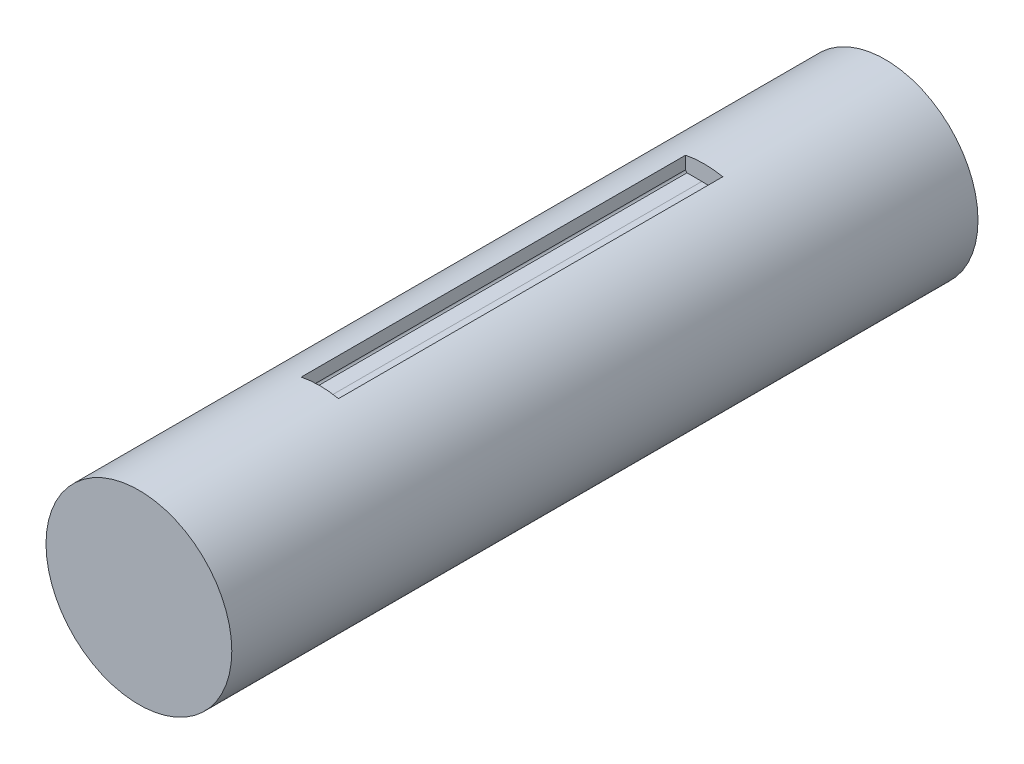
ISO-10303-21;
HEADER;
FILE_DESCRIPTION(('STEP AP214'),'2;1');
FILE_NAME('part.step','',(''),(''),'','','');
FILE_SCHEMA(('AUTOMOTIVE_DESIGN { 1 0 10303 214 1 1 1 1 }'));
ENDSEC;
DATA;
#1=APPLICATION_CONTEXT('core data for automotive mechanical design processes');
#2=APPLICATION_PROTOCOL_DEFINITION('international standard','automotive_design',2000,#1);
#3=PRODUCT_CONTEXT('',#1,'mechanical');
#4=PRODUCT('Part','Part','',(#3));
#5=PRODUCT_RELATED_PRODUCT_CATEGORY('part','',(#4));
#6=PRODUCT_DEFINITION_FORMATION('','',#4);
#7=PRODUCT_DEFINITION_CONTEXT('part definition',#1,'design');
#8=PRODUCT_DEFINITION('design','',#6,#7);
#9=PRODUCT_DEFINITION_SHAPE('','',#8);
#10=(LENGTH_UNIT() NAMED_UNIT(*) SI_UNIT(.MILLI.,.METRE.));
#11=(NAMED_UNIT(*) PLANE_ANGLE_UNIT() SI_UNIT($,.RADIAN.));
#12=(NAMED_UNIT(*) SI_UNIT($,.STERADIAN.) SOLID_ANGLE_UNIT());
#13=UNCERTAINTY_MEASURE_WITH_UNIT(LENGTH_MEASURE(1.E-05),#10,'distance_accuracy_value','');
#14=(GEOMETRIC_REPRESENTATION_CONTEXT(3) GLOBAL_UNCERTAINTY_ASSIGNED_CONTEXT((#13)) GLOBAL_UNIT_ASSIGNED_CONTEXT((#10,
#11,#12)) REPRESENTATION_CONTEXT('',''));
#15=CARTESIAN_POINT('',(0.,0.,0.));
#16=DIRECTION('',(0.,0.,1.));
#17=DIRECTION('',(1.,0.,0.));
#18=AXIS2_PLACEMENT_3D('',#15,#16,#17);
#19=CARTESIAN_POINT('',(0.,0.,100.));
#20=DIRECTION('',(0.,0.,-1.));
#21=DIRECTION('',(-1.,0.,0.));
#22=AXIS2_PLACEMENT_3D('',#19,#20,#21);
#23=CYLINDRICAL_SURFACE('',#22,24.9);
#24=CARTESIAN_POINT('',(0.,0.,-51.5));
#25=DIRECTION('',(0.,0.,1.));
#26=DIRECTION('',(1.,0.,0.));
#27=AXIS2_PLACEMENT_3D('',#24,#25,#26);
#28=CIRCLE('',#27,24.9);
#29=CARTESIAN_POINT('',(4.99999999999997,24.3928268144551,-51.5));
#30=VERTEX_POINT('',#29);
#31=CARTESIAN_POINT('',(-4.99999999999997,24.3928268144551,-51.5));
#32=VERTEX_POINT('',#31);
#33=EDGE_CURVE('E203',#30,#32,#28,.T.);
#34=ORIENTED_EDGE('',*,*,#33,.F.);
#35=DIRECTION('',(0.,0.,1.));
#36=VECTOR('',#35,1.);
#37=CARTESIAN_POINT('',(4.99999999999997,24.3928268144551,-51.5));
#38=LINE('',#37,#36);
#39=CARTESIAN_POINT('',(4.99999999999997,24.3928268144551,51.5));
#40=VERTEX_POINT('',#39);
#41=EDGE_CURVE('E220',#30,#40,#38,.T.);
#42=ORIENTED_EDGE('',*,*,#41,.T.);
#43=CARTESIAN_POINT('',(0.,0.,51.5));
#44=DIRECTION('',(0.,0.,1.));
#45=DIRECTION('',(1.,0.,0.));
#46=AXIS2_PLACEMENT_3D('',#43,#44,#45);
#47=CIRCLE('',#46,24.9);
#48=CARTESIAN_POINT('',(-4.99999999999997,24.3928268144551,51.5));
#49=VERTEX_POINT('',#48);
#50=EDGE_CURVE('E223',#40,#49,#47,.T.);
#51=ORIENTED_EDGE('',*,*,#50,.T.);
#52=DIRECTION('',(0.,0.,1.));
#53=VECTOR('',#52,1.);
#54=CARTESIAN_POINT('',(-4.99999999999997,24.3928268144551,-51.5));
#55=LINE('',#54,#53);
#56=EDGE_CURVE('E248',#32,#49,#55,.T.);
#57=ORIENTED_EDGE('',*,*,#56,.F.);
#58=EDGE_LOOP('',(#34,#42,#51,#57));
#59=FACE_BOUND('',#58,.T.);
#60=CARTESIAN_POINT('',(0.,0.,100.));
#61=DIRECTION('',(0.,0.,1.));
#62=DIRECTION('',(1.,0.,0.));
#63=AXIS2_PLACEMENT_3D('',#60,#61,#62);
#64=CIRCLE('',#63,24.9);
#65=CARTESIAN_POINT('',(24.9,0.,100.));
#66=VERTEX_POINT('',#65);
#67=EDGE_CURVE('E11',#66,#66,#64,.T.);
#68=ORIENTED_EDGE('',*,*,#67,.F.);
#69=EDGE_LOOP('',(#68));
#70=FACE_BOUND('',#69,.T.);
#71=CARTESIAN_POINT('',(0.,0.,-100.));
#72=DIRECTION('',(0.,0.,1.));
#73=DIRECTION('',(1.,0.,0.));
#74=AXIS2_PLACEMENT_3D('',#71,#72,#73);
#75=CIRCLE('',#74,24.9);
#76=CARTESIAN_POINT('',(24.9,0.,-100.));
#77=VERTEX_POINT('',#76);
#78=EDGE_CURVE('E38',#77,#77,#75,.T.);
#79=ORIENTED_EDGE('',*,*,#78,.T.);
#80=EDGE_LOOP('',(#79));
#81=FACE_BOUND('',#80,.T.);
#82=CARTESIAN_POINT('',(0.,0.,-51.5));
#83=DIRECTION('',(0.,0.,1.));
#84=DIRECTION('',(1.,0.,0.));
#85=AXIS2_PLACEMENT_3D('',#82,#83,#84);
#86=CIRCLE('',#85,24.9);
#87=CARTESIAN_POINT('',(-5.00000000000014,-24.392826814455,-51.5));
#88=VERTEX_POINT('',#87);
#89=CARTESIAN_POINT('',(4.9999999999998,-24.3928268144551,-51.5));
#90=VERTEX_POINT('',#89);
#91=EDGE_CURVE('E155',#88,#90,#86,.T.);
#92=ORIENTED_EDGE('',*,*,#91,.F.);
#93=DIRECTION('',(0.,0.,1.));
#94=VECTOR('',#93,1.);
#95=CARTESIAN_POINT('',(-5.00000000000014,-24.392826814455,-51.5));
#96=LINE('',#95,#94);
#97=CARTESIAN_POINT('',(-5.00000000000014,-24.392826814455,51.5));
#98=VERTEX_POINT('',#97);
#99=EDGE_CURVE('E138',#88,#98,#96,.T.);
#100=ORIENTED_EDGE('',*,*,#99,.T.);
#101=CARTESIAN_POINT('',(0.,0.,51.5));
#102=DIRECTION('',(0.,0.,1.));
#103=DIRECTION('',(1.,0.,0.));
#104=AXIS2_PLACEMENT_3D('',#101,#102,#103);
#105=CIRCLE('',#104,24.9);
#106=CARTESIAN_POINT('',(4.9999999999998,-24.3928268144551,51.5));
#107=VERTEX_POINT('',#106);
#108=EDGE_CURVE('E174',#98,#107,#105,.T.);
#109=ORIENTED_EDGE('',*,*,#108,.T.);
#110=DIRECTION('',(0.,0.,1.));
#111=VECTOR('',#110,1.);
#112=CARTESIAN_POINT('',(4.9999999999998,-24.3928268144551,-51.5));
#113=LINE('',#112,#111);
#114=EDGE_CURVE('E148',#90,#107,#113,.T.);
#115=ORIENTED_EDGE('',*,*,#114,.F.);
#116=EDGE_LOOP('',(#92,#100,#109,#115));
#117=FACE_BOUND('',#116,.T.);
#118=ADVANCED_FACE('F35',(#59,#70,#81,#117),#23,.T.);
#119=CARTESIAN_POINT('',(0.,0.,100.));
#120=DIRECTION('',(0.,0.,1.));
#121=DIRECTION('',(1.,0.,0.));
#122=AXIS2_PLACEMENT_3D('',#119,#120,#121);
#123=PLANE('',#122);
#124=ORIENTED_EDGE('',*,*,#67,.T.);
#125=EDGE_LOOP('',(#124));
#126=FACE_BOUND('',#125,.T.);
#127=ADVANCED_FACE('F291',(#126),#123,.T.);
#128=CARTESIAN_POINT('',(0.,0.,-100.));
#129=DIRECTION('',(0.,0.,1.));
#130=DIRECTION('',(1.,0.,0.));
#131=AXIS2_PLACEMENT_3D('',#128,#129,#130);
#132=PLANE('',#131);
#133=ORIENTED_EDGE('',*,*,#78,.F.);
#134=EDGE_LOOP('',(#133));
#135=FACE_BOUND('',#134,.T.);
#136=ADVANCED_FACE('F295',(#135),#132,.F.);
#137=CARTESIAN_POINT('',(4.99999999999997,0.,-51.5));
#138=DIRECTION('',(1.,0.,0.));
#139=DIRECTION('',(0.,0.,-1.));
#140=AXIS2_PLACEMENT_3D('',#137,#138,#139);
#141=PLANE('',#140);
#142=DIRECTION('',(0.,1.,0.));
#143=VECTOR('',#142,1.);
#144=CARTESIAN_POINT('',(4.99999999999997,0.,51.5));
#145=LINE('',#144,#143);
#146=CARTESIAN_POINT('',(4.99999999999997,21.3211721591414,51.5));
#147=VERTEX_POINT('',#146);
#148=EDGE_CURVE('E190',#147,#40,#145,.T.);
#149=ORIENTED_EDGE('',*,*,#148,.T.);
#150=ORIENTED_EDGE('',*,*,#41,.F.);
#151=DIRECTION('',(0.,1.,0.));
#152=VECTOR('',#151,1.);
#153=CARTESIAN_POINT('',(4.99999999999997,0.,-51.5));
#154=LINE('',#153,#152);
#155=CARTESIAN_POINT('',(4.99999999999997,21.3211721591414,-51.5));
#156=VERTEX_POINT('',#155);
#157=EDGE_CURVE('E200',#156,#30,#154,.T.);
#158=ORIENTED_EDGE('',*,*,#157,.F.);
#159=DIRECTION('',(0.,0.,1.));
#160=VECTOR('',#159,1.);
#161=CARTESIAN_POINT('',(4.99999999999997,21.3211721591414,-51.5));
#162=LINE('',#161,#160);
#163=EDGE_CURVE('E238',#156,#147,#162,.T.);
#164=ORIENTED_EDGE('',*,*,#163,.T.);
#165=EDGE_LOOP('',(#149,#150,#158,#164));
#166=FACE_BOUND('',#165,.T.);
#167=ADVANCED_FACE('F257',(#166),#141,.F.);
#168=CARTESIAN_POINT('',(4.00051874332747,21.3533780213462,-51.5));
#169=DIRECTION('',(0.,0.,1.));
#170=DIRECTION('',(1.,0.,0.));
#171=AXIS2_PLACEMENT_3D('',#168,#169,#170);
#172=CYLINDRICAL_SURFACE('',#171,1.);
#173=CARTESIAN_POINT('',(4.00051874332747,21.3533780213462,51.5));
#174=DIRECTION('',(0.,0.,1.));
#175=DIRECTION('',(1.,0.,0.));
#176=AXIS2_PLACEMENT_3D('',#173,#174,#175);
#177=CIRCLE('',#176,1.);
#178=CARTESIAN_POINT('',(3.96831288112261,20.3538967646737,51.5));
#179=VERTEX_POINT('',#178);
#180=EDGE_CURVE('E204',#179,#147,#177,.T.);
#181=ORIENTED_EDGE('',*,*,#180,.T.);
#182=ORIENTED_EDGE('',*,*,#163,.F.);
#183=CARTESIAN_POINT('',(4.00051874332747,21.3533780213462,-51.5));
#184=DIRECTION('',(0.,0.,1.));
#185=DIRECTION('',(1.,0.,0.));
#186=AXIS2_PLACEMENT_3D('',#183,#184,#185);
#187=CIRCLE('',#186,1.);
#188=CARTESIAN_POINT('',(3.96831288112261,20.3538967646737,-51.5));
#189=VERTEX_POINT('',#188);
#190=EDGE_CURVE('E217',#189,#156,#187,.T.);
#191=ORIENTED_EDGE('',*,*,#190,.F.);
#192=DIRECTION('',(0.,0.,1.));
#193=VECTOR('',#192,1.);
#194=CARTESIAN_POINT('',(3.96831288112261,20.3538967646737,-51.5));
#195=LINE('',#194,#193);
#196=EDGE_CURVE('E240',#189,#179,#195,.T.);
#197=ORIENTED_EDGE('',*,*,#196,.T.);
#198=EDGE_LOOP('',(#181,#182,#191,#197));
#199=FACE_BOUND('',#198,.T.);
#200=ADVANCED_FACE('F266',(#199),#172,.F.);
#201=CARTESIAN_POINT('',(0.659290754414498,20.4605219864416,-51.5));
#202=DIRECTION('',(-0.0322058622048559,-0.999481256672501,0.));
#203=DIRECTION('',(0.999481256672501,-0.0322058622048559,0.));
#204=AXIS2_PLACEMENT_3D('',#201,#202,#203);
#205=PLANE('',#204);
#206=DIRECTION('',(0.999481256672501,-0.0322058622048559,0.));
#207=VECTOR('',#206,1.);
#208=CARTESIAN_POINT('',(0.659290754414498,20.4605219864416,51.5));
#209=LINE('',#208,#207);
#210=CARTESIAN_POINT('',(-0.605290303798041,20.5012700475341,51.5));
#211=VERTEX_POINT('',#210);
#212=EDGE_CURVE('E233',#211,#179,#209,.T.);
#213=ORIENTED_EDGE('',*,*,#212,.T.);
#214=ORIENTED_EDGE('',*,*,#196,.F.);
#215=DIRECTION('',(0.999481256672501,-0.0322058622048559,0.));
#216=VECTOR('',#215,1.);
#217=CARTESIAN_POINT('',(0.659290754414498,20.4605219864416,-51.5));
#218=LINE('',#217,#216);
#219=CARTESIAN_POINT('',(-0.605290303798041,20.5012700475341,-51.5));
#220=VERTEX_POINT('',#219);
#221=EDGE_CURVE('E214',#220,#189,#218,.T.);
#222=ORIENTED_EDGE('',*,*,#221,.F.);
#223=DIRECTION('',(0.,0.,1.));
#224=VECTOR('',#223,1.);
#225=CARTESIAN_POINT('',(-0.605290303798041,20.5012700475341,-51.5));
#226=LINE('',#225,#224);
#227=EDGE_CURVE('E242',#220,#211,#226,.T.);
#228=ORIENTED_EDGE('',*,*,#227,.T.);
#229=EDGE_LOOP('',(#213,#214,#222,#228));
#230=FACE_BOUND('',#229,.T.);
#231=ADVANCED_FACE('F272',(#230),#205,.F.);
#232=CARTESIAN_POINT('',(0.,20.5012700475341,-51.5));
#233=DIRECTION('',(0.,1.,0.));
#234=DIRECTION('',(0.,0.,1.));
#235=AXIS2_PLACEMENT_3D('',#232,#233,#234);
#236=PLANE('',#235);
#237=DIRECTION('',(-1.,0.,0.));
#238=VECTOR('',#237,1.);
#239=CARTESIAN_POINT('',(0.,20.5012700475341,51.5));
#240=LINE('',#239,#238);
#241=CARTESIAN_POINT('',(-4.60529030380203,20.5012700475341,51.5));
#242=VERTEX_POINT('',#241);
#243=EDGE_CURVE('E230',#211,#242,#240,.T.);
#244=ORIENTED_EDGE('',*,*,#243,.F.);
#245=ORIENTED_EDGE('',*,*,#227,.F.);
#246=DIRECTION('',(-1.,0.,0.));
#247=VECTOR('',#246,1.);
#248=CARTESIAN_POINT('',(0.,20.5012700475341,-51.5));
#249=LINE('',#248,#247);
#250=CARTESIAN_POINT('',(-4.60529030380203,20.5012700475341,-51.5));
#251=VERTEX_POINT('',#250);
#252=EDGE_CURVE('E212',#220,#251,#249,.T.);
#253=ORIENTED_EDGE('',*,*,#252,.T.);
#254=DIRECTION('',(0.,0.,1.));
#255=VECTOR('',#254,1.);
#256=CARTESIAN_POINT('',(-4.60529030380203,20.5012700475341,-51.5));
#257=LINE('',#256,#255);
#258=EDGE_CURVE('E244',#251,#242,#257,.T.);
#259=ORIENTED_EDGE('',*,*,#258,.T.);
#260=EDGE_LOOP('',(#244,#245,#253,#259));
#261=FACE_BOUND('',#260,.T.);
#262=ADVANCED_FACE('F274',(#261),#236,.T.);
#263=CARTESIAN_POINT('',(-4.05921609750254,21.3390068565704,-51.5));
#264=DIRECTION('',(0.,0.,1.));
#265=DIRECTION('',(1.,0.,0.));
#266=AXIS2_PLACEMENT_3D('',#263,#264,#265);
#267=CYLINDRICAL_SURFACE('',#266,1.00000000000001);
#268=CARTESIAN_POINT('',(-4.05921609750254,21.3390068565704,51.5));
#269=DIRECTION('',(0.,0.,1.));
#270=DIRECTION('',(1.,0.,0.));
#271=AXIS2_PLACEMENT_3D('',#268,#269,#270);
#272=CIRCLE('',#271,1.00000000000001);
#273=CARTESIAN_POINT('',(-4.99999999999997,21.,51.5));
#274=VERTEX_POINT('',#273);
#275=EDGE_CURVE('E227',#274,#242,#272,.T.);
#276=ORIENTED_EDGE('',*,*,#275,.T.);
#277=ORIENTED_EDGE('',*,*,#258,.F.);
#278=CARTESIAN_POINT('',(-4.05921609750254,21.3390068565704,-51.5));
#279=DIRECTION('',(0.,0.,1.));
#280=DIRECTION('',(1.,0.,0.));
#281=AXIS2_PLACEMENT_3D('',#278,#279,#280);
#282=CIRCLE('',#281,1.00000000000001);
#283=CARTESIAN_POINT('',(-4.99999999999997,21.,-51.5));
#284=VERTEX_POINT('',#283);
#285=EDGE_CURVE('E209',#284,#251,#282,.T.);
#286=ORIENTED_EDGE('',*,*,#285,.F.);
#287=DIRECTION('',(0.,0.,1.));
#288=VECTOR('',#287,1.);
#289=CARTESIAN_POINT('',(-4.99999999999997,21.,-51.5));
#290=LINE('',#289,#288);
#291=EDGE_CURVE('E246',#284,#274,#290,.T.);
#292=ORIENTED_EDGE('',*,*,#291,.T.);
#293=EDGE_LOOP('',(#276,#277,#286,#292));
#294=FACE_BOUND('',#293,.T.);
#295=ADVANCED_FACE('F278',(#294),#267,.F.);
#296=CARTESIAN_POINT('',(-4.99999999999997,0.,-51.5));
#297=DIRECTION('',(1.,0.,0.));
#298=DIRECTION('',(0.,0.,-1.));
#299=AXIS2_PLACEMENT_3D('',#296,#297,#298);
#300=PLANE('',#299);
#301=DIRECTION('',(0.,1.,0.));
#302=VECTOR('',#301,1.);
#303=CARTESIAN_POINT('',(-4.99999999999997,0.,51.5));
#304=LINE('',#303,#302);
#305=EDGE_CURVE('E57',#274,#49,#304,.T.);
#306=ORIENTED_EDGE('',*,*,#305,.F.);
#307=ORIENTED_EDGE('',*,*,#291,.F.);
#308=DIRECTION('',(0.,1.,0.));
#309=VECTOR('',#308,1.);
#310=CARTESIAN_POINT('',(-4.99999999999997,0.,-51.5));
#311=LINE('',#310,#309);
#312=EDGE_CURVE('E207',#284,#32,#311,.T.);
#313=ORIENTED_EDGE('',*,*,#312,.T.);
#314=ORIENTED_EDGE('',*,*,#56,.T.);
#315=EDGE_LOOP('',(#306,#307,#313,#314));
#316=FACE_BOUND('',#315,.T.);
#317=ADVANCED_FACE('F280',(#316),#300,.T.);
#318=CARTESIAN_POINT('',(0.,0.,-51.5));
#319=DIRECTION('',(0.,0.,1.));
#320=DIRECTION('',(1.,0.,0.));
#321=AXIS2_PLACEMENT_3D('',#318,#319,#320);
#322=PLANE('',#321);
#323=ORIENTED_EDGE('',*,*,#157,.T.);
#324=ORIENTED_EDGE('',*,*,#33,.T.);
#325=ORIENTED_EDGE('',*,*,#312,.F.);
#326=ORIENTED_EDGE('',*,*,#285,.T.);
#327=ORIENTED_EDGE('',*,*,#252,.F.);
#328=ORIENTED_EDGE('',*,*,#221,.T.);
#329=ORIENTED_EDGE('',*,*,#190,.T.);
#330=EDGE_LOOP('',(#323,#324,#325,#326,#327,#328,#329));
#331=FACE_BOUND('',#330,.T.);
#332=ADVANCED_FACE('F260',(#331),#322,.T.);
#333=CARTESIAN_POINT('',(0.,0.,51.5));
#334=DIRECTION('',(0.,0.,1.));
#335=DIRECTION('',(1.,0.,0.));
#336=AXIS2_PLACEMENT_3D('',#333,#334,#335);
#337=PLANE('',#336);
#338=ORIENTED_EDGE('',*,*,#148,.F.);
#339=ORIENTED_EDGE('',*,*,#180,.F.);
#340=ORIENTED_EDGE('',*,*,#212,.F.);
#341=ORIENTED_EDGE('',*,*,#243,.T.);
#342=ORIENTED_EDGE('',*,*,#275,.F.);
#343=ORIENTED_EDGE('',*,*,#305,.T.);
#344=ORIENTED_EDGE('',*,*,#50,.F.);
#345=EDGE_LOOP('',(#338,#339,#340,#341,#342,#343,#344));
#346=FACE_BOUND('',#345,.T.);
#347=ADVANCED_FACE('F268',(#346),#337,.F.);
#348=CARTESIAN_POINT('',(-4.99999999999997,0.,-51.5));
#349=DIRECTION('',(-1.,0.,0.));
#350=DIRECTION('',(0.,-1.,0.));
#351=AXIS2_PLACEMENT_3D('',#348,#349,#350);
#352=PLANE('',#351);
#353=DIRECTION('',(0.,-1.,0.));
#354=VECTOR('',#353,1.);
#355=CARTESIAN_POINT('',(-4.99999999999997,0.,51.5));
#356=LINE('',#355,#354);
#357=CARTESIAN_POINT('',(-5.00000000000012,-21.3211721591413,51.5));
#358=VERTEX_POINT('',#357);
#359=EDGE_CURVE('E144',#358,#98,#356,.T.);
#360=ORIENTED_EDGE('',*,*,#359,.T.);
#361=ORIENTED_EDGE('',*,*,#99,.F.);
#362=DIRECTION('',(0.,-1.,0.));
#363=VECTOR('',#362,1.);
#364=CARTESIAN_POINT('',(-4.99999999999997,0.,-51.5));
#365=LINE('',#364,#363);
#366=CARTESIAN_POINT('',(-5.00000000000012,-21.3211721591413,-51.5));
#367=VERTEX_POINT('',#366);
#368=EDGE_CURVE('E141',#367,#88,#365,.T.);
#369=ORIENTED_EDGE('',*,*,#368,.F.);
#370=DIRECTION('',(0.,0.,1.));
#371=VECTOR('',#370,1.);
#372=CARTESIAN_POINT('',(-5.00000000000012,-21.3211721591413,-51.5));
#373=LINE('',#372,#371);
#374=EDGE_CURVE('E188',#367,#358,#373,.T.);
#375=ORIENTED_EDGE('',*,*,#374,.T.);
#376=EDGE_LOOP('',(#360,#361,#369,#375));
#377=FACE_BOUND('',#376,.T.);
#378=ADVANCED_FACE('F140',(#377),#352,.F.);
#379=CARTESIAN_POINT('',(-4.00051874332762,-21.3533780213462,-51.5));
#380=DIRECTION('',(0.,0.,1.));
#381=DIRECTION('',(1.,0.,0.));
#382=AXIS2_PLACEMENT_3D('',#379,#380,#381);
#383=CYLINDRICAL_SURFACE('',#382,1.);
#384=CARTESIAN_POINT('',(-4.00051874332762,-21.3533780213462,51.5));
#385=DIRECTION('',(0.,0.,1.));
#386=DIRECTION('',(1.,0.,0.));
#387=AXIS2_PLACEMENT_3D('',#384,#385,#386);
#388=CIRCLE('',#387,1.);
#389=CARTESIAN_POINT('',(-3.96831288112275,-20.3538967646737,51.5));
#390=VERTEX_POINT('',#389);
#391=EDGE_CURVE('E159',#390,#358,#388,.T.);
#392=ORIENTED_EDGE('',*,*,#391,.T.);
#393=ORIENTED_EDGE('',*,*,#374,.F.);
#394=CARTESIAN_POINT('',(-4.00051874332762,-21.3533780213462,-51.5));
#395=DIRECTION('',(0.,0.,1.));
#396=DIRECTION('',(1.,0.,0.));
#397=AXIS2_PLACEMENT_3D('',#394,#395,#396);
#398=CIRCLE('',#397,1.);
#399=CARTESIAN_POINT('',(-3.96831288112275,-20.3538967646737,-51.5));
#400=VERTEX_POINT('',#399);
#401=EDGE_CURVE('E149',#400,#367,#398,.T.);
#402=ORIENTED_EDGE('',*,*,#401,.F.);
#403=DIRECTION('',(0.,0.,1.));
#404=VECTOR('',#403,1.);
#405=CARTESIAN_POINT('',(-3.96831288112275,-20.3538967646737,-51.5));
#406=LINE('',#405,#404);
#407=EDGE_CURVE('E191',#400,#390,#406,.T.);
#408=ORIENTED_EDGE('',*,*,#407,.T.);
#409=EDGE_LOOP('',(#392,#393,#402,#408));
#410=FACE_BOUND('',#409,.T.);
#411=ADVANCED_FACE('F348',(#410),#383,.F.);
#412=CARTESIAN_POINT('',(-0.659290754414638,-20.4605219864416,-51.5));
#413=DIRECTION('',(0.0322058622048628,0.999481256672501,0.));
#414=DIRECTION('',(-0.999481256672501,0.0322058622048628,0.));
#415=AXIS2_PLACEMENT_3D('',#412,#413,#414);
#416=PLANE('',#415);
#417=DIRECTION('',(-0.999481256672501,0.0322058622048628,0.));
#418=VECTOR('',#417,1.);
#419=CARTESIAN_POINT('',(-0.659290754414638,-20.4605219864416,51.5));
#420=LINE('',#419,#418);
#421=CARTESIAN_POINT('',(0.605290303797898,-20.5012700475341,51.5));
#422=VERTEX_POINT('',#421);
#423=EDGE_CURVE('E183',#422,#390,#420,.T.);
#424=ORIENTED_EDGE('',*,*,#423,.T.);
#425=ORIENTED_EDGE('',*,*,#407,.F.);
#426=DIRECTION('',(-0.999481256672501,0.0322058622048628,0.));
#427=VECTOR('',#426,1.);
#428=CARTESIAN_POINT('',(-0.659290754414638,-20.4605219864416,-51.5));
#429=LINE('',#428,#427);
#430=CARTESIAN_POINT('',(0.605290303797898,-20.5012700475341,-51.5));
#431=VERTEX_POINT('',#430);
#432=EDGE_CURVE('E170',#431,#400,#429,.T.);
#433=ORIENTED_EDGE('',*,*,#432,.F.);
#434=DIRECTION('',(0.,0.,1.));
#435=VECTOR('',#434,1.);
#436=CARTESIAN_POINT('',(0.605290303797898,-20.5012700475341,-51.5));
#437=LINE('',#436,#435);
#438=EDGE_CURVE('E193',#431,#422,#437,.T.);
#439=ORIENTED_EDGE('',*,*,#438,.T.);
#440=EDGE_LOOP('',(#424,#425,#433,#439));
#441=FACE_BOUND('',#440,.T.);
#442=ADVANCED_FACE('F357',(#441),#416,.F.);
#443=CARTESIAN_POINT('',(-1.42256137755048E-13,-20.5012700475341,-51.5));
#444=DIRECTION('',(0.,-1.,0.));
#445=DIRECTION('',(1.,0.,0.));
#446=AXIS2_PLACEMENT_3D('',#443,#444,#445);
#447=PLANE('',#446);
#448=DIRECTION('',(1.,0.,0.));
#449=VECTOR('',#448,1.);
#450=CARTESIAN_POINT('',(-1.42256137755048E-13,-20.5012700475341,51.5));
#451=LINE('',#450,#449);
#452=CARTESIAN_POINT('',(4.60529030380189,-20.5012700475341,51.5));
#453=VERTEX_POINT('',#452);
#454=EDGE_CURVE('E180',#422,#453,#451,.T.);
#455=ORIENTED_EDGE('',*,*,#454,.F.);
#456=ORIENTED_EDGE('',*,*,#438,.F.);
#457=DIRECTION('',(1.,0.,0.));
#458=VECTOR('',#457,1.);
#459=CARTESIAN_POINT('',(-1.42256137755048E-13,-20.5012700475341,-51.5));
#460=LINE('',#459,#458);
#461=CARTESIAN_POINT('',(4.60529030380189,-20.5012700475341,-51.5));
#462=VERTEX_POINT('',#461);
#463=EDGE_CURVE('E168',#431,#462,#460,.T.);
#464=ORIENTED_EDGE('',*,*,#463,.T.);
#465=DIRECTION('',(0.,0.,1.));
#466=VECTOR('',#465,1.);
#467=CARTESIAN_POINT('',(4.60529030380189,-20.5012700475341,-51.5));
#468=LINE('',#467,#466);
#469=EDGE_CURVE('E195',#462,#453,#468,.T.);
#470=ORIENTED_EDGE('',*,*,#469,.T.);
#471=EDGE_LOOP('',(#455,#456,#464,#470));
#472=FACE_BOUND('',#471,.T.);
#473=ADVANCED_FACE('F367',(#472),#447,.T.);
#474=CARTESIAN_POINT('',(4.05921609750239,-21.3390068565705,-51.5));
#475=DIRECTION('',(0.,0.,1.));
#476=DIRECTION('',(1.,0.,0.));
#477=AXIS2_PLACEMENT_3D('',#474,#475,#476);
#478=CYLINDRICAL_SURFACE('',#477,1.00000000000001);
#479=CARTESIAN_POINT('',(4.05921609750239,-21.3390068565705,51.5));
#480=DIRECTION('',(0.,0.,1.));
#481=DIRECTION('',(1.,0.,0.));
#482=AXIS2_PLACEMENT_3D('',#479,#480,#481);
#483=CIRCLE('',#482,1.00000000000001);
#484=CARTESIAN_POINT('',(4.99999999999983,-21.0000000000001,51.5));
#485=VERTEX_POINT('',#484);
#486=EDGE_CURVE('E177',#485,#453,#483,.T.);
#487=ORIENTED_EDGE('',*,*,#486,.T.);
#488=ORIENTED_EDGE('',*,*,#469,.F.);
#489=CARTESIAN_POINT('',(4.05921609750239,-21.3390068565705,-51.5));
#490=DIRECTION('',(0.,0.,1.));
#491=DIRECTION('',(1.,0.,0.));
#492=AXIS2_PLACEMENT_3D('',#489,#490,#491);
#493=CIRCLE('',#492,1.00000000000001);
#494=CARTESIAN_POINT('',(4.99999999999983,-21.0000000000001,-51.5));
#495=VERTEX_POINT('',#494);
#496=EDGE_CURVE('E163',#495,#462,#493,.T.);
#497=ORIENTED_EDGE('',*,*,#496,.F.);
#498=DIRECTION('',(0.,0.,1.));
#499=VECTOR('',#498,1.);
#500=CARTESIAN_POINT('',(4.99999999999983,-21.0000000000001,-51.5));
#501=LINE('',#500,#499);
#502=EDGE_CURVE('E197',#495,#485,#501,.T.);
#503=ORIENTED_EDGE('',*,*,#502,.T.);
#504=EDGE_LOOP('',(#487,#488,#497,#503));
#505=FACE_BOUND('',#504,.T.);
#506=ADVANCED_FACE('F377',(#505),#478,.F.);
#507=CARTESIAN_POINT('',(4.99999999999997,0.,-51.5));
#508=DIRECTION('',(-1.,0.,0.));
#509=DIRECTION('',(0.,-1.,0.));
#510=AXIS2_PLACEMENT_3D('',#507,#508,#509);
#511=PLANE('',#510);
#512=DIRECTION('',(0.,-1.,0.));
#513=VECTOR('',#512,1.);
#514=CARTESIAN_POINT('',(4.99999999999997,0.,51.5));
#515=LINE('',#514,#513);
#516=EDGE_CURVE('E49',#485,#107,#515,.T.);
#517=ORIENTED_EDGE('',*,*,#516,.F.);
#518=ORIENTED_EDGE('',*,*,#502,.F.);
#519=DIRECTION('',(0.,-1.,0.));
#520=VECTOR('',#519,1.);
#521=CARTESIAN_POINT('',(4.99999999999997,0.,-51.5));
#522=LINE('',#521,#520);
#523=EDGE_CURVE('E161',#495,#90,#522,.T.);
#524=ORIENTED_EDGE('',*,*,#523,.T.);
#525=ORIENTED_EDGE('',*,*,#114,.T.);
#526=EDGE_LOOP('',(#517,#518,#524,#525));
#527=FACE_BOUND('',#526,.T.);
#528=ADVANCED_FACE('F387',(#527),#511,.T.);
#529=CARTESIAN_POINT('',(0.,0.,-51.5));
#530=DIRECTION('',(0.,0.,1.));
#531=DIRECTION('',(1.,0.,0.));
#532=AXIS2_PLACEMENT_3D('',#529,#530,#531);
#533=PLANE('',#532);
#534=ORIENTED_EDGE('',*,*,#368,.T.);
#535=ORIENTED_EDGE('',*,*,#91,.T.);
#536=ORIENTED_EDGE('',*,*,#523,.F.);
#537=ORIENTED_EDGE('',*,*,#496,.T.);
#538=ORIENTED_EDGE('',*,*,#463,.F.);
#539=ORIENTED_EDGE('',*,*,#432,.T.);
#540=ORIENTED_EDGE('',*,*,#401,.T.);
#541=EDGE_LOOP('',(#534,#535,#536,#537,#538,#539,#540));
#542=FACE_BOUND('',#541,.T.);
#543=ADVANCED_FACE('F153',(#542),#533,.T.);
#544=CARTESIAN_POINT('',(0.,0.,51.5));
#545=DIRECTION('',(0.,0.,1.));
#546=DIRECTION('',(1.,0.,0.));
#547=AXIS2_PLACEMENT_3D('',#544,#545,#546);
#548=PLANE('',#547);
#549=ORIENTED_EDGE('',*,*,#359,.F.);
#550=ORIENTED_EDGE('',*,*,#391,.F.);
#551=ORIENTED_EDGE('',*,*,#423,.F.);
#552=ORIENTED_EDGE('',*,*,#454,.T.);
#553=ORIENTED_EDGE('',*,*,#486,.F.);
#554=ORIENTED_EDGE('',*,*,#516,.T.);
#555=ORIENTED_EDGE('',*,*,#108,.F.);
#556=EDGE_LOOP('',(#549,#550,#551,#552,#553,#554,#555));
#557=FACE_BOUND('',#556,.T.);
#558=ADVANCED_FACE('F406',(#557),#548,.F.);
#559=CLOSED_SHELL('',(#118,#127,#136,#167,#200,#231,#262,#295,#317,#332,#347,#378,#411,#442,
#473,#506,#528,#543,#558));
#560=MANIFOLD_SOLID_BREP('B2',#559);
#561=ADVANCED_BREP_SHAPE_REPRESENTATION('',(#18,#560),#14);
#562=SHAPE_DEFINITION_REPRESENTATION(#9,#561);
ENDSEC;
END-ISO-10303-21;
